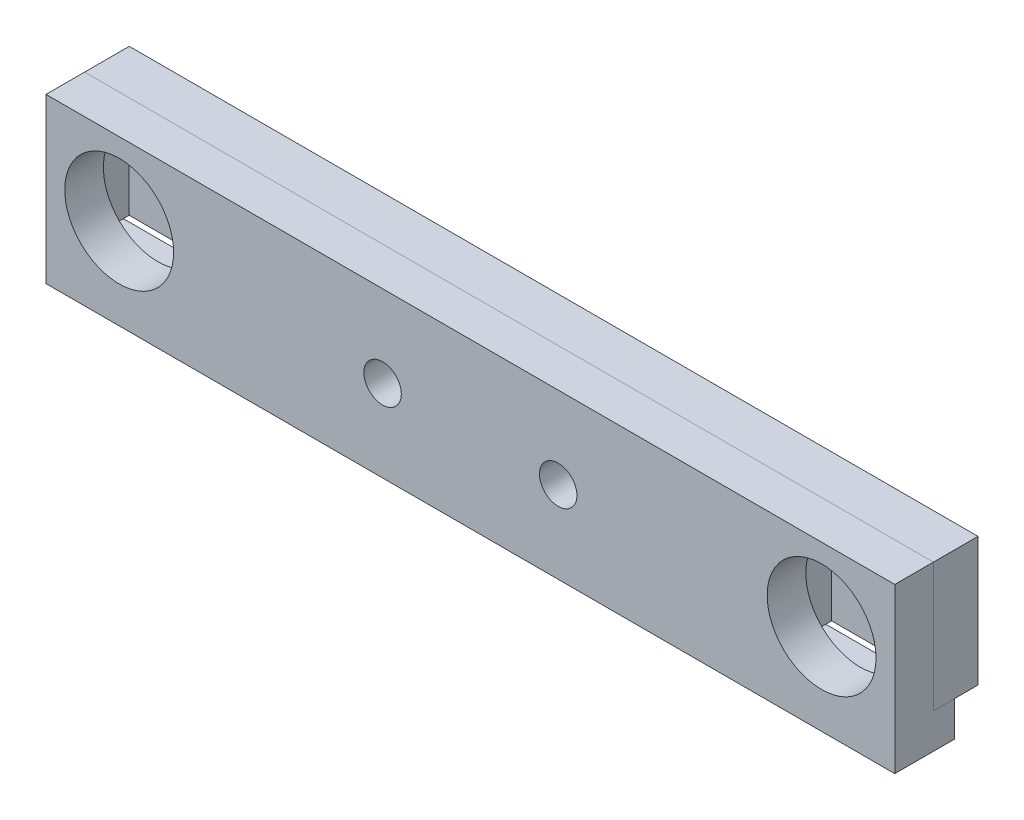
ISO-10303-21;
HEADER;
FILE_DESCRIPTION(('STEP AP214'),'2;1');
FILE_NAME('part.step','',(''),(''),'','','');
FILE_SCHEMA(('AUTOMOTIVE_DESIGN { 1 0 10303 214 1 1 1 1 }'));
ENDSEC;
DATA;
#1=APPLICATION_CONTEXT('core data for automotive mechanical design processes');
#2=APPLICATION_PROTOCOL_DEFINITION('international standard','automotive_design',2000,#1);
#3=PRODUCT_CONTEXT('',#1,'mechanical');
#4=PRODUCT('Part','Part','',(#3));
#5=PRODUCT_RELATED_PRODUCT_CATEGORY('part','',(#4));
#6=PRODUCT_DEFINITION_FORMATION('','',#4);
#7=PRODUCT_DEFINITION_CONTEXT('part definition',#1,'design');
#8=PRODUCT_DEFINITION('design','',#6,#7);
#9=PRODUCT_DEFINITION_SHAPE('','',#8);
#10=(LENGTH_UNIT() NAMED_UNIT(*) SI_UNIT(.MILLI.,.METRE.));
#11=(NAMED_UNIT(*) PLANE_ANGLE_UNIT() SI_UNIT($,.RADIAN.));
#12=(NAMED_UNIT(*) SI_UNIT($,.STERADIAN.) SOLID_ANGLE_UNIT());
#13=UNCERTAINTY_MEASURE_WITH_UNIT(LENGTH_MEASURE(1.E-05),#10,'distance_accuracy_value','');
#14=(GEOMETRIC_REPRESENTATION_CONTEXT(3) GLOBAL_UNCERTAINTY_ASSIGNED_CONTEXT((#13)) GLOBAL_UNIT_ASSIGNED_CONTEXT((#10,
#11,#12)) REPRESENTATION_CONTEXT('',''));
#15=CARTESIAN_POINT('',(0.,0.,0.));
#16=DIRECTION('',(0.,0.,1.));
#17=DIRECTION('',(1.,0.,0.));
#18=AXIS2_PLACEMENT_3D('',#15,#16,#17);
#19=CARTESIAN_POINT('',(0.,0.,3.81));
#20=DIRECTION('',(0.,0.,1.));
#21=DIRECTION('',(1.,0.,0.));
#22=AXIS2_PLACEMENT_3D('',#19,#20,#21);
#23=PLANE('',#22);
#24=CARTESIAN_POINT('',(28.75,4.,3.81));
#25=DIRECTION('',(0.,0.,1.));
#26=DIRECTION('',(1.,0.,0.));
#27=AXIS2_PLACEMENT_3D('',#24,#25,#26);
#28=CIRCLE('',#27,1.60000000000001);
#29=CARTESIAN_POINT('',(30.35,4.,3.81));
#30=VERTEX_POINT('',#29);
#31=EDGE_CURVE('E160',#30,#30,#28,.T.);
#32=ORIENTED_EDGE('',*,*,#31,.T.);
#33=EDGE_LOOP('',(#32));
#34=FACE_BOUND('',#33,.T.);
#35=CARTESIAN_POINT('',(43.75,4.,3.81));
#36=DIRECTION('',(0.,0.,1.));
#37=DIRECTION('',(1.,0.,0.));
#38=AXIS2_PLACEMENT_3D('',#35,#36,#37);
#39=CIRCLE('',#38,1.6);
#40=CARTESIAN_POINT('',(45.35,4.,3.81));
#41=VERTEX_POINT('',#40);
#42=EDGE_CURVE('E248',#41,#41,#39,.T.);
#43=ORIENTED_EDGE('',*,*,#42,.T.);
#44=EDGE_LOOP('',(#43));
#45=FACE_BOUND('',#44,.T.);
#46=CARTESIAN_POINT('',(66.25,4.75,3.81));
#47=DIRECTION('',(0.,0.,1.));
#48=DIRECTION('',(1.,0.,0.));
#49=AXIS2_PLACEMENT_3D('',#46,#47,#48);
#50=CIRCLE('',#49,4.65);
#51=CARTESIAN_POINT('',(70.9,4.75,3.81));
#52=VERTEX_POINT('',#51);
#53=EDGE_CURVE('E145',#52,#52,#50,.T.);
#54=ORIENTED_EDGE('',*,*,#53,.T.);
#55=EDGE_LOOP('',(#54));
#56=FACE_BOUND('',#55,.T.);
#57=CARTESIAN_POINT('',(6.25,4.75,3.81));
#58=DIRECTION('',(0.,0.,1.));
#59=DIRECTION('',(1.,0.,0.));
#60=AXIS2_PLACEMENT_3D('',#57,#58,#59);
#61=CIRCLE('',#60,4.65);
#62=CARTESIAN_POINT('',(10.9,4.75,3.81));
#63=VERTEX_POINT('',#62);
#64=EDGE_CURVE('E163',#63,#63,#61,.T.);
#65=ORIENTED_EDGE('',*,*,#64,.T.);
#66=EDGE_LOOP('',(#65));
#67=FACE_BOUND('',#66,.T.);
#68=DIRECTION('',(1.,0.,0.));
#69=VECTOR('',#68,1.);
#70=CARTESIAN_POINT('',(72.5,0.,3.81));
#71=LINE('',#70,#69);
#72=CARTESIAN_POINT('',(0.,0.,3.81));
#73=VERTEX_POINT('',#72);
#74=CARTESIAN_POINT('',(72.5,0.,3.81));
#75=VERTEX_POINT('',#74);
#76=EDGE_CURVE('E73',#73,#75,#71,.T.);
#77=ORIENTED_EDGE('',*,*,#76,.F.);
#78=DIRECTION('',(0.,-1.,0.));
#79=VECTOR('',#78,1.);
#80=CARTESIAN_POINT('',(0.,11.,3.81));
#81=LINE('',#80,#79);
#82=CARTESIAN_POINT('',(0.,11.,3.81));
#83=VERTEX_POINT('',#82);
#84=EDGE_CURVE('E126',#83,#73,#81,.T.);
#85=ORIENTED_EDGE('',*,*,#84,.F.);
#86=DIRECTION('',(-1.,0.,0.));
#87=VECTOR('',#86,1.);
#88=CARTESIAN_POINT('',(0.,11.,3.81));
#89=LINE('',#88,#87);
#90=CARTESIAN_POINT('',(72.5,11.,3.81));
#91=VERTEX_POINT('',#90);
#92=EDGE_CURVE('E97',#91,#83,#89,.T.);
#93=ORIENTED_EDGE('',*,*,#92,.F.);
#94=DIRECTION('',(0.,1.,0.));
#95=VECTOR('',#94,1.);
#96=CARTESIAN_POINT('',(72.5,11.,3.81));
#97=LINE('',#96,#95);
#98=EDGE_CURVE('E185',#75,#91,#97,.T.);
#99=ORIENTED_EDGE('',*,*,#98,.F.);
#100=EDGE_LOOP('',(#77,#85,#93,#99));
#101=FACE_BOUND('',#100,.T.);
#102=ADVANCED_FACE('F57',(#34,#45,#56,#67,#101),#23,.F.);
#103=CARTESIAN_POINT('',(0.,0.,7.11));
#104=DIRECTION('',(0.,0.,1.));
#105=DIRECTION('',(1.,0.,0.));
#106=AXIS2_PLACEMENT_3D('',#103,#104,#105);
#107=PLANE('',#106);
#108=CARTESIAN_POINT('',(28.75,4.,7.11));
#109=DIRECTION('',(0.,0.,1.));
#110=DIRECTION('',(1.,0.,0.));
#111=AXIS2_PLACEMENT_3D('',#108,#109,#110);
#112=CIRCLE('',#111,1.60000000000001);
#113=CARTESIAN_POINT('',(30.35,4.,7.11));
#114=VERTEX_POINT('',#113);
#115=EDGE_CURVE('E245',#114,#114,#112,.T.);
#116=ORIENTED_EDGE('',*,*,#115,.F.);
#117=EDGE_LOOP('',(#116));
#118=FACE_BOUND('',#117,.T.);
#119=CARTESIAN_POINT('',(43.75,4.,7.11));
#120=DIRECTION('',(0.,0.,1.));
#121=DIRECTION('',(1.,0.,0.));
#122=AXIS2_PLACEMENT_3D('',#119,#120,#121);
#123=CIRCLE('',#122,1.6);
#124=CARTESIAN_POINT('',(45.35,4.,7.11));
#125=VERTEX_POINT('',#124);
#126=EDGE_CURVE('E253',#125,#125,#123,.T.);
#127=ORIENTED_EDGE('',*,*,#126,.F.);
#128=EDGE_LOOP('',(#127));
#129=FACE_BOUND('',#128,.T.);
#130=CARTESIAN_POINT('',(6.25,4.75,7.11));
#131=DIRECTION('',(0.,0.,1.));
#132=DIRECTION('',(1.,0.,0.));
#133=AXIS2_PLACEMENT_3D('',#130,#131,#132);
#134=CIRCLE('',#133,4.65);
#135=CARTESIAN_POINT('',(10.9,4.75,7.11));
#136=VERTEX_POINT('',#135);
#137=EDGE_CURVE('E165',#136,#136,#134,.T.);
#138=ORIENTED_EDGE('',*,*,#137,.F.);
#139=EDGE_LOOP('',(#138));
#140=FACE_BOUND('',#139,.T.);
#141=DIRECTION('',(0.,-1.,0.));
#142=VECTOR('',#141,1.);
#143=CARTESIAN_POINT('',(0.,11.,7.11));
#144=LINE('',#143,#142);
#145=CARTESIAN_POINT('',(0.,11.,7.11));
#146=VERTEX_POINT('',#145);
#147=CARTESIAN_POINT('',(0.,-3.,7.11));
#148=VERTEX_POINT('',#147);
#149=EDGE_CURVE('E172',#146,#148,#144,.T.);
#150=ORIENTED_EDGE('',*,*,#149,.T.);
#151=DIRECTION('',(1.,0.,0.));
#152=VECTOR('',#151,1.);
#153=CARTESIAN_POINT('',(0.,-3.,7.11));
#154=LINE('',#153,#152);
#155=CARTESIAN_POINT('',(72.5,-3.,7.11));
#156=VERTEX_POINT('',#155);
#157=EDGE_CURVE('E104',#148,#156,#154,.T.);
#158=ORIENTED_EDGE('',*,*,#157,.T.);
#159=DIRECTION('',(0.,1.,0.));
#160=VECTOR('',#159,1.);
#161=CARTESIAN_POINT('',(72.5,11.,7.11));
#162=LINE('',#161,#160);
#163=CARTESIAN_POINT('',(72.5,11.,7.11));
#164=VERTEX_POINT('',#163);
#165=EDGE_CURVE('E177',#156,#164,#162,.T.);
#166=ORIENTED_EDGE('',*,*,#165,.T.);
#167=DIRECTION('',(-1.,0.,0.));
#168=VECTOR('',#167,1.);
#169=CARTESIAN_POINT('',(0.,11.,7.11));
#170=LINE('',#169,#168);
#171=EDGE_CURVE('E82',#164,#146,#170,.T.);
#172=ORIENTED_EDGE('',*,*,#171,.T.);
#173=EDGE_LOOP('',(#150,#158,#166,#172));
#174=FACE_BOUND('',#173,.T.);
#175=CARTESIAN_POINT('',(66.25,4.75,7.11));
#176=DIRECTION('',(0.,0.,1.));
#177=DIRECTION('',(1.,0.,0.));
#178=AXIS2_PLACEMENT_3D('',#175,#176,#177);
#179=CIRCLE('',#178,4.65);
#180=CARTESIAN_POINT('',(70.9,4.75,7.11));
#181=VERTEX_POINT('',#180);
#182=EDGE_CURVE('E150',#181,#181,#179,.T.);
#183=ORIENTED_EDGE('',*,*,#182,.F.);
#184=EDGE_LOOP('',(#183));
#185=FACE_BOUND('',#184,.T.);
#186=ADVANCED_FACE('F201',(#118,#129,#140,#174,#185),#107,.T.);
#187=CARTESIAN_POINT('',(0.,11.,7.11));
#188=DIRECTION('',(1.,0.,0.));
#189=DIRECTION('',(0.,0.,-1.));
#190=AXIS2_PLACEMENT_3D('',#187,#188,#189);
#191=PLANE('',#190);
#192=ORIENTED_EDGE('',*,*,#84,.T.);
#193=DIRECTION('',(0.,0.,1.));
#194=VECTOR('',#193,1.);
#195=CARTESIAN_POINT('',(0.,0.,-71.0620424188845));
#196=LINE('',#195,#194);
#197=CARTESIAN_POINT('',(0.,0.,1.99999999999997));
#198=VERTEX_POINT('',#197);
#199=EDGE_CURVE('E120',#198,#73,#196,.T.);
#200=ORIENTED_EDGE('',*,*,#199,.F.);
#201=DIRECTION('',(0.,1.,0.));
#202=VECTOR('',#201,1.);
#203=CARTESIAN_POINT('',(0.,-3.,2.));
#204=LINE('',#203,#202);
#205=CARTESIAN_POINT('',(0.,-3.,1.99999999999997));
#206=VERTEX_POINT('',#205);
#207=EDGE_CURVE('E124',#206,#198,#204,.T.);
#208=ORIENTED_EDGE('',*,*,#207,.F.);
#209=DIRECTION('',(0.,0.,-1.));
#210=VECTOR('',#209,1.);
#211=CARTESIAN_POINT('',(0.,-3.,7.11));
#212=LINE('',#211,#210);
#213=EDGE_CURVE('E13',#148,#206,#212,.T.);
#214=ORIENTED_EDGE('',*,*,#213,.F.);
#215=ORIENTED_EDGE('',*,*,#149,.F.);
#216=DIRECTION('',(0.,0.,-1.));
#217=VECTOR('',#216,1.);
#218=CARTESIAN_POINT('',(0.,11.,7.11));
#219=LINE('',#218,#217);
#220=EDGE_CURVE('E182',#146,#83,#219,.T.);
#221=ORIENTED_EDGE('',*,*,#220,.T.);
#222=EDGE_LOOP('',(#192,#200,#208,#214,#215,#221));
#223=FACE_BOUND('',#222,.T.);
#224=ADVANCED_FACE('F59',(#223),#191,.F.);
#225=CARTESIAN_POINT('',(0.,-3.,7.11));
#226=DIRECTION('',(0.,1.,0.));
#227=DIRECTION('',(0.,0.,1.));
#228=AXIS2_PLACEMENT_3D('',#225,#226,#227);
#229=PLANE('',#228);
#230=ORIENTED_EDGE('',*,*,#213,.T.);
#231=DIRECTION('',(-1.,0.,0.));
#232=VECTOR('',#231,1.);
#233=CARTESIAN_POINT('',(72.5,-3.,2.));
#234=LINE('',#233,#232);
#235=CARTESIAN_POINT('',(72.5,-3.,1.99999999999997));
#236=VERTEX_POINT('',#235);
#237=EDGE_CURVE('E143',#236,#206,#234,.T.);
#238=ORIENTED_EDGE('',*,*,#237,.F.);
#239=DIRECTION('',(0.,0.,-1.));
#240=VECTOR('',#239,1.);
#241=CARTESIAN_POINT('',(72.5,-3.,7.11));
#242=LINE('',#241,#240);
#243=EDGE_CURVE('E66',#156,#236,#242,.T.);
#244=ORIENTED_EDGE('',*,*,#243,.F.);
#245=ORIENTED_EDGE('',*,*,#157,.F.);
#246=EDGE_LOOP('',(#230,#238,#244,#245));
#247=FACE_BOUND('',#246,.T.);
#248=ADVANCED_FACE('F199',(#247),#229,.F.);
#249=CARTESIAN_POINT('',(72.5,11.,7.11));
#250=DIRECTION('',(-1.,0.,0.));
#251=DIRECTION('',(0.,0.,1.));
#252=AXIS2_PLACEMENT_3D('',#249,#250,#251);
#253=PLANE('',#252);
#254=ORIENTED_EDGE('',*,*,#243,.T.);
#255=DIRECTION('',(0.,-1.,0.));
#256=VECTOR('',#255,1.);
#257=CARTESIAN_POINT('',(72.5,-3.,2.));
#258=LINE('',#257,#256);
#259=CARTESIAN_POINT('',(72.5,0.,2.));
#260=VERTEX_POINT('',#259);
#261=EDGE_CURVE('E139',#260,#236,#258,.T.);
#262=ORIENTED_EDGE('',*,*,#261,.F.);
#263=DIRECTION('',(0.,0.,1.));
#264=VECTOR('',#263,1.);
#265=CARTESIAN_POINT('',(72.5,0.,-71.0620424188845));
#266=LINE('',#265,#264);
#267=EDGE_CURVE('E129',#260,#75,#266,.T.);
#268=ORIENTED_EDGE('',*,*,#267,.T.);
#269=ORIENTED_EDGE('',*,*,#98,.T.);
#270=DIRECTION('',(0.,0.,-1.));
#271=VECTOR('',#270,1.);
#272=CARTESIAN_POINT('',(72.5,11.,7.11));
#273=LINE('',#272,#271);
#274=EDGE_CURVE('E192',#164,#91,#273,.T.);
#275=ORIENTED_EDGE('',*,*,#274,.F.);
#276=ORIENTED_EDGE('',*,*,#165,.F.);
#277=EDGE_LOOP('',(#254,#262,#268,#269,#275,#276));
#278=FACE_BOUND('',#277,.T.);
#279=ADVANCED_FACE('F197',(#278),#253,.F.);
#280=CARTESIAN_POINT('',(0.,11.,7.11));
#281=DIRECTION('',(0.,-1.,0.));
#282=DIRECTION('',(0.,0.,-1.));
#283=AXIS2_PLACEMENT_3D('',#280,#281,#282);
#284=PLANE('',#283);
#285=ORIENTED_EDGE('',*,*,#92,.T.);
#286=ORIENTED_EDGE('',*,*,#220,.F.);
#287=ORIENTED_EDGE('',*,*,#171,.F.);
#288=ORIENTED_EDGE('',*,*,#274,.T.);
#289=EDGE_LOOP('',(#285,#286,#287,#288));
#290=FACE_BOUND('',#289,.T.);
#291=ADVANCED_FACE('F203',(#290),#284,.F.);
#292=CARTESIAN_POINT('',(6.25,4.75,7.11));
#293=DIRECTION('',(0.,0.,-1.));
#294=DIRECTION('',(-1.,0.,0.));
#295=AXIS2_PLACEMENT_3D('',#292,#293,#294);
#296=CYLINDRICAL_SURFACE('',#295,4.65);
#297=ORIENTED_EDGE('',*,*,#137,.T.);
#298=EDGE_LOOP('',(#297));
#299=FACE_BOUND('',#298,.T.);
#300=ORIENTED_EDGE('',*,*,#64,.F.);
#301=EDGE_LOOP('',(#300));
#302=FACE_BOUND('',#301,.T.);
#303=ADVANCED_FACE('F205',(#299,#302),#296,.F.);
#304=CARTESIAN_POINT('',(66.25,4.75,7.11));
#305=DIRECTION('',(0.,0.,-1.));
#306=DIRECTION('',(-1.,0.,0.));
#307=AXIS2_PLACEMENT_3D('',#304,#305,#306);
#308=CYLINDRICAL_SURFACE('',#307,4.65);
#309=ORIENTED_EDGE('',*,*,#182,.T.);
#310=EDGE_LOOP('',(#309));
#311=FACE_BOUND('',#310,.T.);
#312=ORIENTED_EDGE('',*,*,#53,.F.);
#313=EDGE_LOOP('',(#312));
#314=FACE_BOUND('',#313,.T.);
#315=ADVANCED_FACE('F210',(#311,#314),#308,.F.);
#316=CARTESIAN_POINT('',(72.5,0.,-71.0620424188845));
#317=DIRECTION('',(0.,-1.,0.));
#318=DIRECTION('',(0.,0.,-1.));
#319=AXIS2_PLACEMENT_3D('',#316,#317,#318);
#320=PLANE('',#319);
#321=DIRECTION('',(1.,0.,0.));
#322=VECTOR('',#321,1.);
#323=CARTESIAN_POINT('',(72.5,0.,2.));
#324=LINE('',#323,#322);
#325=EDGE_CURVE('E132',#198,#260,#324,.T.);
#326=ORIENTED_EDGE('',*,*,#325,.F.);
#327=ORIENTED_EDGE('',*,*,#199,.T.);
#328=ORIENTED_EDGE('',*,*,#76,.T.);
#329=ORIENTED_EDGE('',*,*,#267,.F.);
#330=EDGE_LOOP('',(#326,#327,#328,#329));
#331=FACE_BOUND('',#330,.T.);
#332=ADVANCED_FACE('F133',(#331),#320,.F.);
#333=CARTESIAN_POINT('',(0.,0.,2.));
#334=DIRECTION('',(0.,0.,-1.));
#335=DIRECTION('',(-1.,0.,0.));
#336=AXIS2_PLACEMENT_3D('',#333,#334,#335);
#337=PLANE('',#336);
#338=ORIENTED_EDGE('',*,*,#325,.T.);
#339=ORIENTED_EDGE('',*,*,#261,.T.);
#340=ORIENTED_EDGE('',*,*,#237,.T.);
#341=ORIENTED_EDGE('',*,*,#207,.T.);
#342=EDGE_LOOP('',(#338,#339,#340,#341));
#343=FACE_BOUND('',#342,.T.);
#344=ADVANCED_FACE('F141',(#343),#337,.T.);
#345=CARTESIAN_POINT('',(43.75,4.,0.));
#346=DIRECTION('',(0.,0.,1.));
#347=DIRECTION('',(1.,0.,0.));
#348=AXIS2_PLACEMENT_3D('',#345,#346,#347);
#349=CYLINDRICAL_SURFACE('',#348,1.6);
#350=ORIENTED_EDGE('',*,*,#126,.T.);
#351=EDGE_LOOP('',(#350));
#352=FACE_BOUND('',#351,.T.);
#353=ORIENTED_EDGE('',*,*,#42,.F.);
#354=EDGE_LOOP('',(#353));
#355=FACE_BOUND('',#354,.T.);
#356=ADVANCED_FACE('F231',(#352,#355),#349,.F.);
#357=CARTESIAN_POINT('',(28.75,4.,0.));
#358=DIRECTION('',(0.,0.,1.));
#359=DIRECTION('',(1.,0.,0.));
#360=AXIS2_PLACEMENT_3D('',#357,#358,#359);
#361=CYLINDRICAL_SURFACE('',#360,1.60000000000001);
#362=ORIENTED_EDGE('',*,*,#115,.T.);
#363=EDGE_LOOP('',(#362));
#364=FACE_BOUND('',#363,.T.);
#365=ORIENTED_EDGE('',*,*,#31,.F.);
#366=EDGE_LOOP('',(#365));
#367=FACE_BOUND('',#366,.T.);
#368=ADVANCED_FACE('F236',(#364,#367),#361,.F.);
#369=CLOSED_SHELL('',(#102,#186,#224,#248,#279,#291,#303,#315,#332,#344,#356,#368));
#370=MANIFOLD_SOLID_BREP('B2',#369);
#371=CARTESIAN_POINT('',(0.,0.,1.5));
#372=DIRECTION('',(0.,0.,-1.));
#373=DIRECTION('',(-1.,0.,0.));
#374=AXIS2_PLACEMENT_3D('',#371,#372,#373);
#375=PLANE('',#374);
#376=DIRECTION('',(0.,-1.,0.));
#377=VECTOR('',#376,1.);
#378=CARTESIAN_POINT('',(70.9999999999999,9.5,1.5));
#379=LINE('',#378,#377);
#380=CARTESIAN_POINT('',(70.9999999999999,9.5,1.5));
#381=VERTEX_POINT('',#380);
#382=CARTESIAN_POINT('',(70.9999999999999,0.,1.5));
#383=VERTEX_POINT('',#382);
#384=EDGE_CURVE('E370',#381,#383,#379,.T.);
#385=ORIENTED_EDGE('',*,*,#384,.F.);
#386=DIRECTION('',(1.,0.,0.));
#387=VECTOR('',#386,1.);
#388=CARTESIAN_POINT('',(61.4999999999999,9.5,1.5));
#389=LINE('',#388,#387);
#390=CARTESIAN_POINT('',(61.4999999999999,9.5,1.5));
#391=VERTEX_POINT('',#390);
#392=EDGE_CURVE('E374',#391,#381,#389,.T.);
#393=ORIENTED_EDGE('',*,*,#392,.F.);
#394=DIRECTION('',(0.,1.,0.));
#395=VECTOR('',#394,1.);
#396=CARTESIAN_POINT('',(61.4999999999999,9.5,1.5));
#397=LINE('',#396,#395);
#398=CARTESIAN_POINT('',(61.4999999999999,0.,1.5));
#399=VERTEX_POINT('',#398);
#400=EDGE_CURVE('E533',#399,#391,#397,.T.);
#401=ORIENTED_EDGE('',*,*,#400,.F.);
#402=DIRECTION('',(1.,0.,0.));
#403=VECTOR('',#402,1.);
#404=CARTESIAN_POINT('',(0.,0.,1.5));
#405=LINE('',#404,#403);
#406=EDGE_CURVE('E476',#399,#383,#405,.T.);
#407=ORIENTED_EDGE('',*,*,#406,.T.);
#408=EDGE_LOOP('',(#385,#393,#401,#407));
#409=FACE_BOUND('',#408,.T.);
#410=ADVANCED_FACE('F353',(#409),#375,.F.);
#411=DIRECTION('',(0.,1.,0.));
#412=VECTOR('',#411,1.);
#413=CARTESIAN_POINT('',(1.5,9.5,1.5));
#414=LINE('',#413,#412);
#415=CARTESIAN_POINT('',(1.5,0.,1.5));
#416=VERTEX_POINT('',#415);
#417=CARTESIAN_POINT('',(1.5,9.5,1.5));
#418=VERTEX_POINT('',#417);
#419=EDGE_CURVE('E466',#416,#418,#414,.T.);
#420=ORIENTED_EDGE('',*,*,#419,.F.);
#421=CARTESIAN_POINT('',(11.,0.,1.5));
#422=VERTEX_POINT('',#421);
#423=EDGE_CURVE('E477',#416,#422,#405,.T.);
#424=ORIENTED_EDGE('',*,*,#423,.T.);
#425=DIRECTION('',(0.,-1.,0.));
#426=VECTOR('',#425,1.);
#427=CARTESIAN_POINT('',(11.,9.5,1.5));
#428=LINE('',#427,#426);
#429=CARTESIAN_POINT('',(11.,9.5,1.5));
#430=VERTEX_POINT('',#429);
#431=EDGE_CURVE('E530',#430,#422,#428,.T.);
#432=ORIENTED_EDGE('',*,*,#431,.F.);
#433=DIRECTION('',(1.,0.,0.));
#434=VECTOR('',#433,1.);
#435=CARTESIAN_POINT('',(1.5,9.5,1.5));
#436=LINE('',#435,#434);
#437=EDGE_CURVE('E528',#418,#430,#436,.T.);
#438=ORIENTED_EDGE('',*,*,#437,.F.);
#439=EDGE_LOOP('',(#420,#424,#432,#438));
#440=FACE_BOUND('',#439,.T.);
#441=ADVANCED_FACE('F559',(#440),#375,.F.);
#442=CARTESIAN_POINT('',(0.,0.,1.5));
#443=DIRECTION('',(1.,0.,0.));
#444=DIRECTION('',(0.,0.,-1.));
#445=AXIS2_PLACEMENT_3D('',#442,#443,#444);
#446=PLANE('',#445);
#447=DIRECTION('',(0.,-1.,0.));
#448=VECTOR('',#447,1.);
#449=CARTESIAN_POINT('',(0.,0.,0.));
#450=LINE('',#449,#448);
#451=CARTESIAN_POINT('',(0.,11.,0.));
#452=VERTEX_POINT('',#451);
#453=CARTESIAN_POINT('',(0.,0.,0.));
#454=VERTEX_POINT('',#453);
#455=EDGE_CURVE('E467',#452,#454,#450,.T.);
#456=ORIENTED_EDGE('',*,*,#455,.T.);
#457=DIRECTION('',(0.,0.,-1.));
#458=VECTOR('',#457,1.);
#459=CARTESIAN_POINT('',(0.,0.,1.5));
#460=LINE('',#459,#458);
#461=CARTESIAN_POINT('',(0.,0.,3.81));
#462=VERTEX_POINT('',#461);
#463=EDGE_CURVE('E55',#462,#454,#460,.T.);
#464=ORIENTED_EDGE('',*,*,#463,.F.);
#465=DIRECTION('',(0.,-1.,0.));
#466=VECTOR('',#465,1.);
#467=CARTESIAN_POINT('',(0.,11.,3.81));
#468=LINE('',#467,#466);
#469=CARTESIAN_POINT('',(0.,11.,3.81));
#470=VERTEX_POINT('',#469);
#471=EDGE_CURVE('E523',#470,#462,#468,.T.);
#472=ORIENTED_EDGE('',*,*,#471,.F.);
#473=DIRECTION('',(0.,0.,-1.));
#474=VECTOR('',#473,1.);
#475=CARTESIAN_POINT('',(0.,11.,1.5));
#476=LINE('',#475,#474);
#477=EDGE_CURVE('E484',#470,#452,#476,.T.);
#478=ORIENTED_EDGE('',*,*,#477,.T.);
#479=EDGE_LOOP('',(#456,#464,#472,#478));
#480=FACE_BOUND('',#479,.T.);
#481=ADVANCED_FACE('F355',(#480),#446,.F.);
#482=CARTESIAN_POINT('',(0.,0.,1.5));
#483=DIRECTION('',(0.,1.,0.));
#484=DIRECTION('',(-1.,0.,0.));
#485=AXIS2_PLACEMENT_3D('',#482,#483,#484);
#486=PLANE('',#485);
#487=DIRECTION('',(1.,0.,0.));
#488=VECTOR('',#487,1.);
#489=CARTESIAN_POINT('',(0.,0.,0.));
#490=LINE('',#489,#488);
#491=CARTESIAN_POINT('',(72.5,0.,0.));
#492=VERTEX_POINT('',#491);
#493=EDGE_CURVE('E470',#454,#492,#490,.T.);
#494=ORIENTED_EDGE('',*,*,#493,.T.);
#495=DIRECTION('',(0.,0.,-1.));
#496=VECTOR('',#495,1.);
#497=CARTESIAN_POINT('',(72.5,0.,1.5));
#498=LINE('',#497,#496);
#499=CARTESIAN_POINT('',(72.5,0.,3.81));
#500=VERTEX_POINT('',#499);
#501=EDGE_CURVE('E362',#500,#492,#498,.T.);
#502=ORIENTED_EDGE('',*,*,#501,.F.);
#503=DIRECTION('',(1.,0.,0.));
#504=VECTOR('',#503,1.);
#505=CARTESIAN_POINT('',(70.9999999999999,0.,3.81));
#506=LINE('',#505,#504);
#507=CARTESIAN_POINT('',(70.9999999999999,0.,3.81));
#508=VERTEX_POINT('',#507);
#509=EDGE_CURVE('E514',#508,#500,#506,.T.);
#510=ORIENTED_EDGE('',*,*,#509,.F.);
#511=DIRECTION('',(0.,0.,-1.));
#512=VECTOR('',#511,1.);
#513=CARTESIAN_POINT('',(70.9999999999999,0.,3.81));
#514=LINE('',#513,#512);
#515=EDGE_CURVE('E538',#508,#383,#514,.T.);
#516=ORIENTED_EDGE('',*,*,#515,.T.);
#517=ORIENTED_EDGE('',*,*,#406,.F.);
#518=DIRECTION('',(0.,0.,-1.));
#519=VECTOR('',#518,1.);
#520=CARTESIAN_POINT('',(61.4999999999999,0.,3.81));
#521=LINE('',#520,#519);
#522=CARTESIAN_POINT('',(61.4999999999999,0.,3.81));
#523=VERTEX_POINT('',#522);
#524=EDGE_CURVE('E547',#523,#399,#521,.T.);
#525=ORIENTED_EDGE('',*,*,#524,.F.);
#526=DIRECTION('',(1.,0.,0.));
#527=VECTOR('',#526,1.);
#528=CARTESIAN_POINT('',(11.,0.,3.81));
#529=LINE('',#528,#527);
#530=CARTESIAN_POINT('',(11.,0.,3.81));
#531=VERTEX_POINT('',#530);
#532=EDGE_CURVE('E506',#531,#523,#529,.T.);
#533=ORIENTED_EDGE('',*,*,#532,.F.);
#534=DIRECTION('',(0.,0.,-1.));
#535=VECTOR('',#534,1.);
#536=CARTESIAN_POINT('',(11.,0.,3.81));
#537=LINE('',#536,#535);
#538=EDGE_CURVE('E472',#531,#422,#537,.T.);
#539=ORIENTED_EDGE('',*,*,#538,.T.);
#540=ORIENTED_EDGE('',*,*,#423,.F.);
#541=DIRECTION('',(0.,0.,-1.));
#542=VECTOR('',#541,1.);
#543=CARTESIAN_POINT('',(1.5,0.,3.81));
#544=LINE('',#543,#542);
#545=CARTESIAN_POINT('',(1.5,0.,3.81));
#546=VERTEX_POINT('',#545);
#547=EDGE_CURVE('E526',#546,#416,#544,.T.);
#548=ORIENTED_EDGE('',*,*,#547,.F.);
#549=DIRECTION('',(1.,0.,0.));
#550=VECTOR('',#549,1.);
#551=CARTESIAN_POINT('',(0.,0.,3.81));
#552=LINE('',#551,#550);
#553=EDGE_CURVE('E460',#462,#546,#552,.T.);
#554=ORIENTED_EDGE('',*,*,#553,.F.);
#555=ORIENTED_EDGE('',*,*,#463,.T.);
#556=EDGE_LOOP('',(#494,#502,#510,#516,#517,#525,#533,#539,#540,#548,#554,#555));
#557=FACE_BOUND('',#556,.T.);
#558=ADVANCED_FACE('F554',(#557),#486,.F.);
#559=CARTESIAN_POINT('',(72.5,0.,1.5));
#560=DIRECTION('',(-1.,0.,0.));
#561=DIRECTION('',(0.,0.,1.));
#562=AXIS2_PLACEMENT_3D('',#559,#560,#561);
#563=PLANE('',#562);
#564=DIRECTION('',(0.,1.,0.));
#565=VECTOR('',#564,1.);
#566=CARTESIAN_POINT('',(72.5,0.,0.));
#567=LINE('',#566,#565);
#568=CARTESIAN_POINT('',(72.5,11.,0.));
#569=VERTEX_POINT('',#568);
#570=EDGE_CURVE('E481',#492,#569,#567,.T.);
#571=ORIENTED_EDGE('',*,*,#570,.T.);
#572=DIRECTION('',(0.,0.,-1.));
#573=VECTOR('',#572,1.);
#574=CARTESIAN_POINT('',(72.5,11.,1.5));
#575=LINE('',#574,#573);
#576=CARTESIAN_POINT('',(72.5,11.,3.81));
#577=VERTEX_POINT('',#576);
#578=EDGE_CURVE('E487',#577,#569,#575,.T.);
#579=ORIENTED_EDGE('',*,*,#578,.F.);
#580=DIRECTION('',(0.,1.,0.));
#581=VECTOR('',#580,1.);
#582=CARTESIAN_POINT('',(72.5,0.,3.81));
#583=LINE('',#582,#581);
#584=EDGE_CURVE('E517',#500,#577,#583,.T.);
#585=ORIENTED_EDGE('',*,*,#584,.F.);
#586=ORIENTED_EDGE('',*,*,#501,.T.);
#587=EDGE_LOOP('',(#571,#579,#585,#586));
#588=FACE_BOUND('',#587,.T.);
#589=ADVANCED_FACE('F576',(#588),#563,.F.);
#590=CARTESIAN_POINT('',(0.,11.,1.5));
#591=DIRECTION('',(0.,-1.,0.));
#592=DIRECTION('',(0.,0.,-1.));
#593=AXIS2_PLACEMENT_3D('',#590,#591,#592);
#594=PLANE('',#593);
#595=DIRECTION('',(-1.,0.,0.));
#596=VECTOR('',#595,1.);
#597=CARTESIAN_POINT('',(0.,11.,0.));
#598=LINE('',#597,#596);
#599=EDGE_CURVE('E478',#569,#452,#598,.T.);
#600=ORIENTED_EDGE('',*,*,#599,.T.);
#601=ORIENTED_EDGE('',*,*,#477,.F.);
#602=DIRECTION('',(-1.,0.,0.));
#603=VECTOR('',#602,1.);
#604=CARTESIAN_POINT('',(72.5,11.,3.81));
#605=LINE('',#604,#603);
#606=EDGE_CURVE('E520',#577,#470,#605,.T.);
#607=ORIENTED_EDGE('',*,*,#606,.F.);
#608=ORIENTED_EDGE('',*,*,#578,.T.);
#609=EDGE_LOOP('',(#600,#601,#607,#608));
#610=FACE_BOUND('',#609,.T.);
#611=ADVANCED_FACE('F573',(#610),#594,.F.);
#612=CARTESIAN_POINT('',(0.,0.,0.));
#613=DIRECTION('',(0.,0.,-1.));
#614=DIRECTION('',(-1.,0.,0.));
#615=AXIS2_PLACEMENT_3D('',#612,#613,#614);
#616=PLANE('',#615);
#617=CARTESIAN_POINT('',(28.75,4.,0.));
#618=DIRECTION('',(0.,0.,1.));
#619=DIRECTION('',(1.,0.,0.));
#620=AXIS2_PLACEMENT_3D('',#617,#618,#619);
#621=CIRCLE('',#620,1.60000000000001);
#622=CARTESIAN_POINT('',(30.35,4.,0.));
#623=VERTEX_POINT('',#622);
#624=EDGE_CURVE('E493',#623,#623,#621,.T.);
#625=ORIENTED_EDGE('',*,*,#624,.T.);
#626=EDGE_LOOP('',(#625));
#627=FACE_BOUND('',#626,.T.);
#628=CARTESIAN_POINT('',(43.75,4.,0.));
#629=DIRECTION('',(0.,0.,1.));
#630=DIRECTION('',(1.,0.,0.));
#631=AXIS2_PLACEMENT_3D('',#628,#629,#630);
#632=CIRCLE('',#631,1.6);
#633=CARTESIAN_POINT('',(45.35,4.,0.));
#634=VERTEX_POINT('',#633);
#635=EDGE_CURVE('E498',#634,#634,#632,.T.);
#636=ORIENTED_EDGE('',*,*,#635,.T.);
#637=EDGE_LOOP('',(#636));
#638=FACE_BOUND('',#637,.T.);
#639=ORIENTED_EDGE('',*,*,#455,.F.);
#640=ORIENTED_EDGE('',*,*,#599,.F.);
#641=ORIENTED_EDGE('',*,*,#570,.F.);
#642=ORIENTED_EDGE('',*,*,#493,.F.);
#643=EDGE_LOOP('',(#639,#640,#641,#642));
#644=FACE_BOUND('',#643,.T.);
#645=ADVANCED_FACE('F570',(#627,#638,#644),#616,.T.);
#646=CARTESIAN_POINT('',(1.5,9.5,3.81));
#647=DIRECTION('',(-1.,0.,0.));
#648=DIRECTION('',(0.,-1.,0.));
#649=AXIS2_PLACEMENT_3D('',#646,#647,#648);
#650=PLANE('',#649);
#651=ORIENTED_EDGE('',*,*,#419,.T.);
#652=DIRECTION('',(0.,0.,-1.));
#653=VECTOR('',#652,1.);
#654=CARTESIAN_POINT('',(1.5,9.5,3.81));
#655=LINE('',#654,#653);
#656=CARTESIAN_POINT('',(1.5,9.5,3.81));
#657=VERTEX_POINT('',#656);
#658=EDGE_CURVE('E447',#657,#418,#655,.T.);
#659=ORIENTED_EDGE('',*,*,#658,.F.);
#660=DIRECTION('',(0.,1.,0.));
#661=VECTOR('',#660,1.);
#662=CARTESIAN_POINT('',(1.5,9.5,3.81));
#663=LINE('',#662,#661);
#664=EDGE_CURVE('E454',#546,#657,#663,.T.);
#665=ORIENTED_EDGE('',*,*,#664,.F.);
#666=ORIENTED_EDGE('',*,*,#547,.T.);
#667=EDGE_LOOP('',(#651,#659,#665,#666));
#668=FACE_BOUND('',#667,.T.);
#669=ADVANCED_FACE('F465',(#668),#650,.F.);
#670=CARTESIAN_POINT('',(1.5,9.5,3.81));
#671=DIRECTION('',(0.,1.,0.));
#672=DIRECTION('',(0.,0.,1.));
#673=AXIS2_PLACEMENT_3D('',#670,#671,#672);
#674=PLANE('',#673);
#675=ORIENTED_EDGE('',*,*,#437,.T.);
#676=DIRECTION('',(0.,0.,-1.));
#677=VECTOR('',#676,1.);
#678=CARTESIAN_POINT('',(11.,9.5,3.81));
#679=LINE('',#678,#677);
#680=CARTESIAN_POINT('',(11.,9.5,3.81));
#681=VERTEX_POINT('',#680);
#682=EDGE_CURVE('E450',#681,#430,#679,.T.);
#683=ORIENTED_EDGE('',*,*,#682,.F.);
#684=DIRECTION('',(1.,0.,0.));
#685=VECTOR('',#684,1.);
#686=CARTESIAN_POINT('',(1.5,9.5,3.81));
#687=LINE('',#686,#685);
#688=EDGE_CURVE('E442',#657,#681,#687,.T.);
#689=ORIENTED_EDGE('',*,*,#688,.F.);
#690=ORIENTED_EDGE('',*,*,#658,.T.);
#691=EDGE_LOOP('',(#675,#683,#689,#690));
#692=FACE_BOUND('',#691,.T.);
#693=ADVANCED_FACE('F445',(#692),#674,.F.);
#694=CARTESIAN_POINT('',(11.,9.5,3.81));
#695=DIRECTION('',(1.,0.,0.));
#696=DIRECTION('',(0.,1.,0.));
#697=AXIS2_PLACEMENT_3D('',#694,#695,#696);
#698=PLANE('',#697);
#699=ORIENTED_EDGE('',*,*,#431,.T.);
#700=ORIENTED_EDGE('',*,*,#538,.F.);
#701=DIRECTION('',(0.,-1.,0.));
#702=VECTOR('',#701,1.);
#703=CARTESIAN_POINT('',(11.,9.5,3.81));
#704=LINE('',#703,#702);
#705=EDGE_CURVE('E453',#681,#531,#704,.T.);
#706=ORIENTED_EDGE('',*,*,#705,.F.);
#707=ORIENTED_EDGE('',*,*,#682,.T.);
#708=EDGE_LOOP('',(#699,#700,#706,#707));
#709=FACE_BOUND('',#708,.T.);
#710=ADVANCED_FACE('F557',(#709),#698,.F.);
#711=CARTESIAN_POINT('',(61.4999999999999,9.5,3.81));
#712=DIRECTION('',(-1.,0.,0.));
#713=DIRECTION('',(0.,0.,1.));
#714=AXIS2_PLACEMENT_3D('',#711,#712,#713);
#715=PLANE('',#714);
#716=ORIENTED_EDGE('',*,*,#400,.T.);
#717=DIRECTION('',(0.,0.,-1.));
#718=VECTOR('',#717,1.);
#719=CARTESIAN_POINT('',(61.4999999999999,9.5,3.81));
#720=LINE('',#719,#718);
#721=CARTESIAN_POINT('',(61.4999999999999,9.5,3.81));
#722=VERTEX_POINT('',#721);
#723=EDGE_CURVE('E544',#722,#391,#720,.T.);
#724=ORIENTED_EDGE('',*,*,#723,.F.);
#725=DIRECTION('',(0.,1.,0.));
#726=VECTOR('',#725,1.);
#727=CARTESIAN_POINT('',(61.4999999999999,9.5,3.81));
#728=LINE('',#727,#726);
#729=EDGE_CURVE('E508',#523,#722,#728,.T.);
#730=ORIENTED_EDGE('',*,*,#729,.F.);
#731=ORIENTED_EDGE('',*,*,#524,.T.);
#732=EDGE_LOOP('',(#716,#724,#730,#731));
#733=FACE_BOUND('',#732,.T.);
#734=ADVANCED_FACE('F614',(#733),#715,.F.);
#735=CARTESIAN_POINT('',(61.4999999999999,9.5,3.81));
#736=DIRECTION('',(0.,1.,0.));
#737=DIRECTION('',(0.,0.,1.));
#738=AXIS2_PLACEMENT_3D('',#735,#736,#737);
#739=PLANE('',#738);
#740=ORIENTED_EDGE('',*,*,#392,.T.);
#741=DIRECTION('',(0.,0.,-1.));
#742=VECTOR('',#741,1.);
#743=CARTESIAN_POINT('',(70.9999999999999,9.5,3.81));
#744=LINE('',#743,#742);
#745=CARTESIAN_POINT('',(70.9999999999999,9.5,3.81));
#746=VERTEX_POINT('',#745);
#747=EDGE_CURVE('E541',#746,#381,#744,.T.);
#748=ORIENTED_EDGE('',*,*,#747,.F.);
#749=DIRECTION('',(1.,0.,0.));
#750=VECTOR('',#749,1.);
#751=CARTESIAN_POINT('',(61.4999999999999,9.5,3.81));
#752=LINE('',#751,#750);
#753=EDGE_CURVE('E510',#722,#746,#752,.T.);
#754=ORIENTED_EDGE('',*,*,#753,.F.);
#755=ORIENTED_EDGE('',*,*,#723,.T.);
#756=EDGE_LOOP('',(#740,#748,#754,#755));
#757=FACE_BOUND('',#756,.T.);
#758=ADVANCED_FACE('F622',(#757),#739,.F.);
#759=CARTESIAN_POINT('',(70.9999999999999,9.5,3.81));
#760=DIRECTION('',(1.,0.,0.));
#761=DIRECTION('',(0.,0.,-1.));
#762=AXIS2_PLACEMENT_3D('',#759,#760,#761);
#763=PLANE('',#762);
#764=ORIENTED_EDGE('',*,*,#384,.T.);
#765=ORIENTED_EDGE('',*,*,#515,.F.);
#766=DIRECTION('',(0.,-1.,0.));
#767=VECTOR('',#766,1.);
#768=CARTESIAN_POINT('',(70.9999999999999,9.5,3.81));
#769=LINE('',#768,#767);
#770=EDGE_CURVE('E512',#746,#508,#769,.T.);
#771=ORIENTED_EDGE('',*,*,#770,.F.);
#772=ORIENTED_EDGE('',*,*,#747,.T.);
#773=EDGE_LOOP('',(#764,#765,#771,#772));
#774=FACE_BOUND('',#773,.T.);
#775=ADVANCED_FACE('F631',(#774),#763,.F.);
#776=CARTESIAN_POINT('',(0.,0.,3.81));
#777=DIRECTION('',(0.,0.,1.));
#778=DIRECTION('',(1.,0.,0.));
#779=AXIS2_PLACEMENT_3D('',#776,#777,#778);
#780=PLANE('',#779);
#781=CARTESIAN_POINT('',(28.75,4.,3.81));
#782=DIRECTION('',(0.,0.,1.));
#783=DIRECTION('',(1.,0.,0.));
#784=AXIS2_PLACEMENT_3D('',#781,#782,#783);
#785=CIRCLE('',#784,1.60000000000001);
#786=CARTESIAN_POINT('',(30.35,4.,3.81));
#787=VERTEX_POINT('',#786);
#788=EDGE_CURVE('E357',#787,#787,#785,.T.);
#789=ORIENTED_EDGE('',*,*,#788,.F.);
#790=EDGE_LOOP('',(#789));
#791=FACE_BOUND('',#790,.T.);
#792=CARTESIAN_POINT('',(43.75,4.,3.81));
#793=DIRECTION('',(0.,0.,1.));
#794=DIRECTION('',(1.,0.,0.));
#795=AXIS2_PLACEMENT_3D('',#792,#793,#794);
#796=CIRCLE('',#795,1.6);
#797=CARTESIAN_POINT('',(45.35,4.,3.81));
#798=VERTEX_POINT('',#797);
#799=EDGE_CURVE('E491',#798,#798,#796,.T.);
#800=ORIENTED_EDGE('',*,*,#799,.F.);
#801=EDGE_LOOP('',(#800));
#802=FACE_BOUND('',#801,.T.);
#803=ORIENTED_EDGE('',*,*,#664,.T.);
#804=ORIENTED_EDGE('',*,*,#688,.T.);
#805=ORIENTED_EDGE('',*,*,#705,.T.);
#806=ORIENTED_EDGE('',*,*,#532,.T.);
#807=ORIENTED_EDGE('',*,*,#729,.T.);
#808=ORIENTED_EDGE('',*,*,#753,.T.);
#809=ORIENTED_EDGE('',*,*,#770,.T.);
#810=ORIENTED_EDGE('',*,*,#509,.T.);
#811=ORIENTED_EDGE('',*,*,#584,.T.);
#812=ORIENTED_EDGE('',*,*,#606,.T.);
#813=ORIENTED_EDGE('',*,*,#471,.T.);
#814=ORIENTED_EDGE('',*,*,#553,.T.);
#815=EDGE_LOOP('',(#803,#804,#805,#806,#807,#808,#809,#810,#811,#812,#813,#814));
#816=FACE_BOUND('',#815,.T.);
#817=ADVANCED_FACE('F457',(#791,#802,#816),#780,.T.);
#818=CARTESIAN_POINT('',(43.75,4.,0.));
#819=DIRECTION('',(0.,0.,1.));
#820=DIRECTION('',(1.,0.,0.));
#821=AXIS2_PLACEMENT_3D('',#818,#819,#820);
#822=CYLINDRICAL_SURFACE('',#821,1.6);
#823=ORIENTED_EDGE('',*,*,#799,.T.);
#824=EDGE_LOOP('',(#823));
#825=FACE_BOUND('',#824,.T.);
#826=ORIENTED_EDGE('',*,*,#635,.F.);
#827=EDGE_LOOP('',(#826));
#828=FACE_BOUND('',#827,.T.);
#829=ADVANCED_FACE('F654',(#825,#828),#822,.F.);
#830=CARTESIAN_POINT('',(28.75,4.,0.));
#831=DIRECTION('',(0.,0.,1.));
#832=DIRECTION('',(1.,0.,0.));
#833=AXIS2_PLACEMENT_3D('',#830,#831,#832);
#834=CYLINDRICAL_SURFACE('',#833,1.60000000000001);
#835=ORIENTED_EDGE('',*,*,#788,.T.);
#836=EDGE_LOOP('',(#835));
#837=FACE_BOUND('',#836,.T.);
#838=ORIENTED_EDGE('',*,*,#624,.F.);
#839=EDGE_LOOP('',(#838));
#840=FACE_BOUND('',#839,.T.);
#841=ADVANCED_FACE('F663',(#837,#840),#834,.F.);
#842=CLOSED_SHELL('',(#410,#441,#481,#558,#589,#611,#645,#669,#693,#710,#734,#758,#775,#817,
#829,#841));
#843=MANIFOLD_SOLID_BREP('B7',#842);
#844=ADVANCED_BREP_SHAPE_REPRESENTATION('',(#18,#370,#843),#14);
#845=SHAPE_DEFINITION_REPRESENTATION(#9,#844);
ENDSEC;
END-ISO-10303-21;
